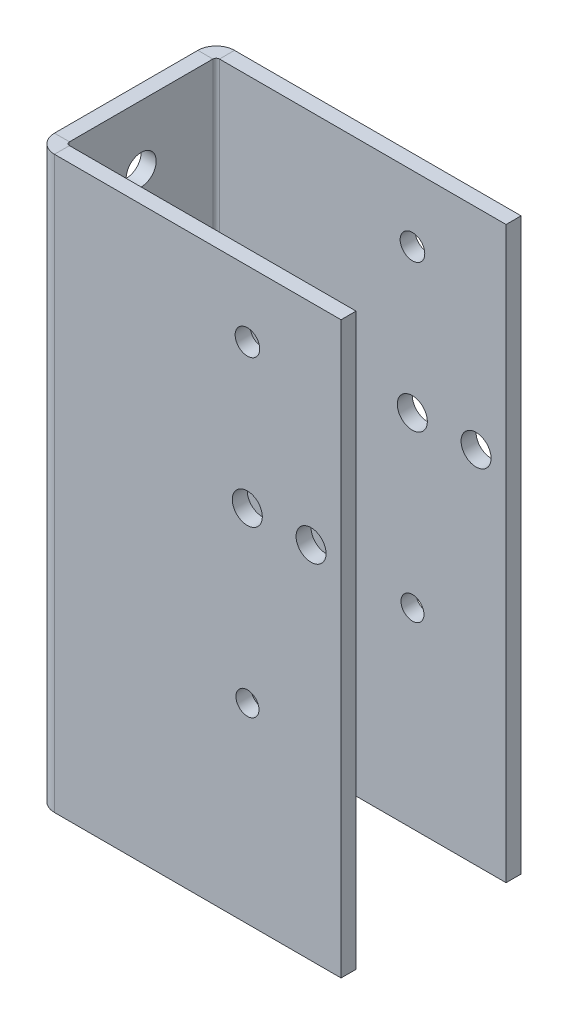
ISO-10303-21;
HEADER;
FILE_DESCRIPTION(('STEP AP214'),'2;1');
FILE_NAME('part.step','',(''),(''),'','','');
FILE_SCHEMA(('AUTOMOTIVE_DESIGN { 1 0 10303 214 1 1 1 1 }'));
ENDSEC;
DATA;
#1=APPLICATION_CONTEXT('core data for automotive mechanical design processes');
#2=APPLICATION_PROTOCOL_DEFINITION('international standard','automotive_design',2000,#1);
#3=PRODUCT_CONTEXT('',#1,'mechanical');
#4=PRODUCT('Part','Part','',(#3));
#5=PRODUCT_RELATED_PRODUCT_CATEGORY('part','',(#4));
#6=PRODUCT_DEFINITION_FORMATION('','',#4);
#7=PRODUCT_DEFINITION_CONTEXT('part definition',#1,'design');
#8=PRODUCT_DEFINITION('design','',#6,#7);
#9=PRODUCT_DEFINITION_SHAPE('','',#8);
#10=(LENGTH_UNIT() NAMED_UNIT(*) SI_UNIT(.MILLI.,.METRE.));
#11=(NAMED_UNIT(*) PLANE_ANGLE_UNIT() SI_UNIT($,.RADIAN.));
#12=(NAMED_UNIT(*) SI_UNIT($,.STERADIAN.) SOLID_ANGLE_UNIT());
#13=UNCERTAINTY_MEASURE_WITH_UNIT(LENGTH_MEASURE(1.E-05),#10,'distance_accuracy_value','');
#14=(GEOMETRIC_REPRESENTATION_CONTEXT(3) GLOBAL_UNCERTAINTY_ASSIGNED_CONTEXT((#13)) GLOBAL_UNIT_ASSIGNED_CONTEXT((#10,
#11,#12)) REPRESENTATION_CONTEXT('',''));
#15=CARTESIAN_POINT('',(0.,0.,0.));
#16=DIRECTION('',(0.,0.,1.));
#17=DIRECTION('',(1.,0.,0.));
#18=AXIS2_PLACEMENT_3D('',#15,#16,#17);
#19=CARTESIAN_POINT('',(-18.885,76.,10.));
#20=DIRECTION('',(0.,1.,0.));
#21=DIRECTION('',(0.,0.,1.));
#22=AXIS2_PLACEMENT_3D('',#19,#20,#21);
#23=PLANE('',#22);
#24=DIRECTION('',(0.,0.,1.));
#25=VECTOR('',#24,1.);
#26=CARTESIAN_POINT('',(-18.885,76.,10.));
#27=LINE('',#26,#25);
#28=CARTESIAN_POINT('',(-18.885,76.,10.));
#29=VERTEX_POINT('',#28);
#30=CARTESIAN_POINT('',(-18.885,76.,12.));
#31=VERTEX_POINT('',#30);
#32=EDGE_CURVE('E11',#29,#31,#27,.T.);
#33=ORIENTED_EDGE('',*,*,#32,.F.);
#34=CARTESIAN_POINT('',(-18.885,76.,9.56));
#35=DIRECTION('',(0.,1.,0.));
#36=DIRECTION('',(0.,0.,1.));
#37=AXIS2_PLACEMENT_3D('',#34,#35,#36);
#38=CIRCLE('',#37,0.44);
#39=CARTESIAN_POINT('',(-19.325,76.,9.56));
#40=VERTEX_POINT('',#39);
#41=EDGE_CURVE('E243',#40,#29,#38,.T.);
#42=ORIENTED_EDGE('',*,*,#41,.F.);
#43=DIRECTION('',(1.,0.,0.));
#44=VECTOR('',#43,1.);
#45=CARTESIAN_POINT('',(-21.325,76.,9.56));
#46=LINE('',#45,#44);
#47=CARTESIAN_POINT('',(-21.325,76.,9.56));
#48=VERTEX_POINT('',#47);
#49=EDGE_CURVE('E45',#48,#40,#46,.T.);
#50=ORIENTED_EDGE('',*,*,#49,.F.);
#51=CARTESIAN_POINT('',(-18.885,76.,9.56));
#52=DIRECTION('',(0.,1.,0.));
#53=DIRECTION('',(1.,0.,0.));
#54=AXIS2_PLACEMENT_3D('',#51,#52,#53);
#55=CIRCLE('',#54,2.44);
#56=EDGE_CURVE('E169',#48,#31,#55,.T.);
#57=ORIENTED_EDGE('',*,*,#56,.T.);
#58=EDGE_LOOP('',(#33,#42,#50,#57));
#59=FACE_BOUND('',#58,.T.);
#60=ADVANCED_FACE('F37',(#59),#23,.T.);
#61=CARTESIAN_POINT('',(-21.325,76.,9.56));
#62=DIRECTION('',(0.,1.,0.));
#63=DIRECTION('',(0.,0.,1.));
#64=AXIS2_PLACEMENT_3D('',#61,#62,#63);
#65=PLANE('',#64);
#66=DIRECTION('',(1.,0.,0.));
#67=VECTOR('',#66,1.);
#68=CARTESIAN_POINT('',(19.325,76.,10.));
#69=LINE('',#68,#67);
#70=CARTESIAN_POINT('',(19.325,76.,10.));
#71=VERTEX_POINT('',#70);
#72=EDGE_CURVE('E247',#29,#71,#69,.T.);
#73=ORIENTED_EDGE('',*,*,#72,.F.);
#74=ORIENTED_EDGE('',*,*,#32,.T.);
#75=DIRECTION('',(1.,0.,0.));
#76=VECTOR('',#75,1.);
#77=CARTESIAN_POINT('',(19.325,76.,12.));
#78=LINE('',#77,#76);
#79=CARTESIAN_POINT('',(19.325,76.,12.));
#80=VERTEX_POINT('',#79);
#81=EDGE_CURVE('E105',#31,#80,#78,.T.);
#82=ORIENTED_EDGE('',*,*,#81,.T.);
#83=DIRECTION('',(0.,0.,1.));
#84=VECTOR('',#83,1.);
#85=CARTESIAN_POINT('',(19.325,76.,10.));
#86=LINE('',#85,#84);
#87=EDGE_CURVE('E698',#71,#80,#86,.T.);
#88=ORIENTED_EDGE('',*,*,#87,.F.);
#89=EDGE_LOOP('',(#73,#74,#82,#88));
#90=FACE_BOUND('',#89,.T.);
#91=ADVANCED_FACE('F296',(#90),#65,.T.);
#92=CARTESIAN_POINT('',(-19.325,0.,9.56));
#93=DIRECTION('',(0.,-1.,0.));
#94=DIRECTION('',(0.,0.,-1.));
#95=AXIS2_PLACEMENT_3D('',#92,#93,#94);
#96=PLANE('',#95);
#97=DIRECTION('',(-1.,0.,0.));
#98=VECTOR('',#97,1.);
#99=CARTESIAN_POINT('',(-19.325,0.,9.56));
#100=LINE('',#99,#98);
#101=CARTESIAN_POINT('',(-19.325,0.,9.56));
#102=VERTEX_POINT('',#101);
#103=CARTESIAN_POINT('',(-21.325,0.,9.56));
#104=VERTEX_POINT('',#103);
#105=EDGE_CURVE('E92',#102,#104,#100,.T.);
#106=ORIENTED_EDGE('',*,*,#105,.F.);
#107=CARTESIAN_POINT('',(-18.885,0.,9.56));
#108=DIRECTION('',(0.,1.,0.));
#109=DIRECTION('',(0.,0.,1.));
#110=AXIS2_PLACEMENT_3D('',#107,#108,#109);
#111=CIRCLE('',#110,0.44);
#112=CARTESIAN_POINT('',(-18.885,0.,10.));
#113=VERTEX_POINT('',#112);
#114=EDGE_CURVE('E185',#102,#113,#111,.T.);
#115=ORIENTED_EDGE('',*,*,#114,.T.);
#116=DIRECTION('',(0.,0.,-1.));
#117=VECTOR('',#116,1.);
#118=CARTESIAN_POINT('',(-18.885,0.,12.));
#119=LINE('',#118,#117);
#120=CARTESIAN_POINT('',(-18.885,0.,12.));
#121=VERTEX_POINT('',#120);
#122=EDGE_CURVE('E99',#121,#113,#119,.T.);
#123=ORIENTED_EDGE('',*,*,#122,.F.);
#124=CARTESIAN_POINT('',(-18.885,0.,9.56));
#125=DIRECTION('',(0.,1.,0.));
#126=DIRECTION('',(1.,0.,0.));
#127=AXIS2_PLACEMENT_3D('',#124,#125,#126);
#128=CIRCLE('',#127,2.44);
#129=EDGE_CURVE('E204',#104,#121,#128,.T.);
#130=ORIENTED_EDGE('',*,*,#129,.F.);
#131=EDGE_LOOP('',(#106,#115,#123,#130));
#132=FACE_BOUND('',#131,.T.);
#133=ADVANCED_FACE('F300',(#132),#96,.T.);
#134=CARTESIAN_POINT('',(-18.885,0.,12.));
#135=DIRECTION('',(0.,-1.,0.));
#136=DIRECTION('',(0.,0.,-1.));
#137=AXIS2_PLACEMENT_3D('',#134,#135,#136);
#138=PLANE('',#137);
#139=DIRECTION('',(0.,0.,1.));
#140=VECTOR('',#139,1.);
#141=CARTESIAN_POINT('',(-19.325,0.,10.));
#142=LINE('',#141,#140);
#143=CARTESIAN_POINT('',(-19.325,0.,-9.56));
#144=VERTEX_POINT('',#143);
#145=EDGE_CURVE('E187',#144,#102,#142,.T.);
#146=ORIENTED_EDGE('',*,*,#145,.T.);
#147=ORIENTED_EDGE('',*,*,#105,.T.);
#148=DIRECTION('',(0.,0.,-1.));
#149=VECTOR('',#148,1.);
#150=CARTESIAN_POINT('',(-21.325,0.,10.));
#151=LINE('',#150,#149);
#152=CARTESIAN_POINT('',(-21.325,0.,-9.56));
#153=VERTEX_POINT('',#152);
#154=EDGE_CURVE('E202',#153,#104,#151,.F.);
#155=ORIENTED_EDGE('',*,*,#154,.F.);
#156=DIRECTION('',(1.,0.,0.));
#157=VECTOR('',#156,1.);
#158=CARTESIAN_POINT('',(-21.325,0.,-9.56));
#159=LINE('',#158,#157);
#160=EDGE_CURVE('E230',#153,#144,#159,.T.);
#161=ORIENTED_EDGE('',*,*,#160,.T.);
#162=EDGE_LOOP('',(#146,#147,#155,#161));
#163=FACE_BOUND('',#162,.T.);
#164=ADVANCED_FACE('F273',(#163),#138,.T.);
#165=CARTESIAN_POINT('',(-19.325,76.,-9.56));
#166=DIRECTION('',(0.,1.,0.));
#167=DIRECTION('',(0.,0.,1.));
#168=AXIS2_PLACEMENT_3D('',#165,#166,#167);
#169=PLANE('',#168);
#170=DIRECTION('',(-1.,0.,0.));
#171=VECTOR('',#170,1.);
#172=CARTESIAN_POINT('',(-19.325,76.,-9.56));
#173=LINE('',#172,#171);
#174=CARTESIAN_POINT('',(-19.325,76.,-9.56));
#175=VERTEX_POINT('',#174);
#176=CARTESIAN_POINT('',(-21.325,76.,-9.56));
#177=VERTEX_POINT('',#176);
#178=EDGE_CURVE('E133',#175,#177,#173,.T.);
#179=ORIENTED_EDGE('',*,*,#178,.F.);
#180=CARTESIAN_POINT('',(-18.885,76.,-9.56));
#181=DIRECTION('',(0.,1.,0.));
#182=DIRECTION('',(0.,0.,1.));
#183=AXIS2_PLACEMENT_3D('',#180,#181,#182);
#184=CIRCLE('',#183,0.44);
#185=CARTESIAN_POINT('',(-18.885,76.,-10.));
#186=VERTEX_POINT('',#185);
#187=EDGE_CURVE('E250',#186,#175,#184,.T.);
#188=ORIENTED_EDGE('',*,*,#187,.F.);
#189=DIRECTION('',(0.,0.,1.));
#190=VECTOR('',#189,1.);
#191=CARTESIAN_POINT('',(-18.885,76.,-12.));
#192=LINE('',#191,#190);
#193=CARTESIAN_POINT('',(-18.885,76.,-12.));
#194=VERTEX_POINT('',#193);
#195=EDGE_CURVE('E145',#194,#186,#192,.T.);
#196=ORIENTED_EDGE('',*,*,#195,.F.);
#197=CARTESIAN_POINT('',(-18.885,76.,-9.56));
#198=DIRECTION('',(0.,1.,0.));
#199=DIRECTION('',(1.,0.,0.));
#200=AXIS2_PLACEMENT_3D('',#197,#198,#199);
#201=CIRCLE('',#200,2.44);
#202=EDGE_CURVE('E148',#194,#177,#201,.T.);
#203=ORIENTED_EDGE('',*,*,#202,.T.);
#204=EDGE_LOOP('',(#179,#188,#196,#203));
#205=FACE_BOUND('',#204,.T.);
#206=ADVANCED_FACE('F150',(#205),#169,.T.);
#207=CARTESIAN_POINT('',(-18.885,76.,-12.));
#208=DIRECTION('',(0.,1.,0.));
#209=DIRECTION('',(0.,0.,1.));
#210=AXIS2_PLACEMENT_3D('',#207,#208,#209);
#211=PLANE('',#210);
#212=DIRECTION('',(0.,0.,1.));
#213=VECTOR('',#212,1.);
#214=CARTESIAN_POINT('',(-19.325,76.,10.));
#215=LINE('',#214,#213);
#216=EDGE_CURVE('E140',#175,#40,#215,.T.);
#217=ORIENTED_EDGE('',*,*,#216,.F.);
#218=ORIENTED_EDGE('',*,*,#178,.T.);
#219=DIRECTION('',(0.,0.,-1.));
#220=VECTOR('',#219,1.);
#221=CARTESIAN_POINT('',(-21.325,76.,10.));
#222=LINE('',#221,#220);
#223=EDGE_CURVE('E137',#177,#48,#222,.F.);
#224=ORIENTED_EDGE('',*,*,#223,.T.);
#225=ORIENTED_EDGE('',*,*,#49,.T.);
#226=EDGE_LOOP('',(#217,#218,#224,#225));
#227=FACE_BOUND('',#226,.T.);
#228=ADVANCED_FACE('F135',(#227),#211,.T.);
#229=CARTESIAN_POINT('',(-18.885,0.,-10.));
#230=DIRECTION('',(0.,-1.,0.));
#231=DIRECTION('',(0.,0.,-1.));
#232=AXIS2_PLACEMENT_3D('',#229,#230,#231);
#233=PLANE('',#232);
#234=DIRECTION('',(0.,0.,-1.));
#235=VECTOR('',#234,1.);
#236=CARTESIAN_POINT('',(-18.885,0.,-10.));
#237=LINE('',#236,#235);
#238=CARTESIAN_POINT('',(-18.885,0.,-10.));
#239=VERTEX_POINT('',#238);
#240=CARTESIAN_POINT('',(-18.885,0.,-12.));
#241=VERTEX_POINT('',#240);
#242=EDGE_CURVE('E232',#239,#241,#237,.T.);
#243=ORIENTED_EDGE('',*,*,#242,.F.);
#244=CARTESIAN_POINT('',(-18.885,0.,-9.56));
#245=DIRECTION('',(0.,1.,0.));
#246=DIRECTION('',(0.,0.,1.));
#247=AXIS2_PLACEMENT_3D('',#244,#245,#246);
#248=CIRCLE('',#247,0.44);
#249=EDGE_CURVE('E189',#239,#144,#248,.T.);
#250=ORIENTED_EDGE('',*,*,#249,.T.);
#251=ORIENTED_EDGE('',*,*,#160,.F.);
#252=CARTESIAN_POINT('',(-18.885,0.,-9.56));
#253=DIRECTION('',(0.,1.,0.));
#254=DIRECTION('',(1.,0.,0.));
#255=AXIS2_PLACEMENT_3D('',#252,#253,#254);
#256=CIRCLE('',#255,2.44);
#257=EDGE_CURVE('E161',#241,#153,#256,.T.);
#258=ORIENTED_EDGE('',*,*,#257,.F.);
#259=EDGE_LOOP('',(#243,#250,#251,#258));
#260=FACE_BOUND('',#259,.T.);
#261=ADVANCED_FACE('F271',(#260),#233,.T.);
#262=CARTESIAN_POINT('',(-21.325,0.,-9.56));
#263=DIRECTION('',(0.,-1.,0.));
#264=DIRECTION('',(0.,0.,-1.));
#265=AXIS2_PLACEMENT_3D('',#262,#263,#264);
#266=PLANE('',#265);
#267=DIRECTION('',(-1.,0.,0.));
#268=VECTOR('',#267,1.);
#269=CARTESIAN_POINT('',(19.325,0.,-10.));
#270=LINE('',#269,#268);
#271=CARTESIAN_POINT('',(19.325,0.,-10.));
#272=VERTEX_POINT('',#271);
#273=EDGE_CURVE('E192',#272,#239,#270,.T.);
#274=ORIENTED_EDGE('',*,*,#273,.T.);
#275=ORIENTED_EDGE('',*,*,#242,.T.);
#276=DIRECTION('',(-1.,0.,0.));
#277=VECTOR('',#276,1.);
#278=CARTESIAN_POINT('',(19.325,0.,-12.));
#279=LINE('',#278,#277);
#280=CARTESIAN_POINT('',(19.325,0.,-12.));
#281=VERTEX_POINT('',#280);
#282=EDGE_CURVE('E198',#281,#241,#279,.T.);
#283=ORIENTED_EDGE('',*,*,#282,.F.);
#284=DIRECTION('',(0.,0.,1.));
#285=VECTOR('',#284,1.);
#286=CARTESIAN_POINT('',(19.325,0.,-12.));
#287=LINE('',#286,#285);
#288=EDGE_CURVE('E195',#281,#272,#287,.T.);
#289=ORIENTED_EDGE('',*,*,#288,.T.);
#290=EDGE_LOOP('',(#274,#275,#283,#289));
#291=FACE_BOUND('',#290,.T.);
#292=ADVANCED_FACE('F283',(#291),#266,.T.);
#293=CARTESIAN_POINT('',(19.325,76.,12.));
#294=DIRECTION('',(0.,0.,-1.));
#295=DIRECTION('',(-1.,0.,0.));
#296=AXIS2_PLACEMENT_3D('',#293,#294,#295);
#297=PLANE('',#296);
#298=CARTESIAN_POINT('',(15.325,48.,12.));
#299=DIRECTION('',(0.,0.,-1.));
#300=DIRECTION('',(-1.,0.,0.));
#301=AXIS2_PLACEMENT_3D('',#298,#299,#300);
#302=CIRCLE('',#301,2.);
#303=CARTESIAN_POINT('',(13.325,48.,12.));
#304=VERTEX_POINT('',#303);
#305=EDGE_CURVE('E653',#304,#304,#302,.F.);
#306=ORIENTED_EDGE('',*,*,#305,.F.);
#307=EDGE_LOOP('',(#306));
#308=FACE_BOUND('',#307,.T.);
#309=CARTESIAN_POINT('',(6.825,48.,12.));
#310=DIRECTION('',(0.,0.,-1.));
#311=DIRECTION('',(-1.,0.,0.));
#312=AXIS2_PLACEMENT_3D('',#309,#310,#311);
#313=CIRCLE('',#312,2.00000000000001);
#314=CARTESIAN_POINT('',(4.82499999999999,48.,12.));
#315=VERTEX_POINT('',#314);
#316=EDGE_CURVE('E665',#315,#315,#313,.F.);
#317=ORIENTED_EDGE('',*,*,#316,.F.);
#318=EDGE_LOOP('',(#317));
#319=FACE_BOUND('',#318,.T.);
#320=CARTESIAN_POINT('',(6.845,25.5,12.));
#321=DIRECTION('',(0.,0.,-1.));
#322=DIRECTION('',(-1.,0.,0.));
#323=AXIS2_PLACEMENT_3D('',#320,#321,#322);
#324=CIRCLE('',#323,1.53399793358523);
#325=CARTESIAN_POINT('',(5.31100206641477,25.5,12.));
#326=VERTEX_POINT('',#325);
#327=EDGE_CURVE('E677',#326,#326,#324,.F.);
#328=ORIENTED_EDGE('',*,*,#327,.F.);
#329=EDGE_LOOP('',(#328));
#330=FACE_BOUND('',#329,.T.);
#331=CARTESIAN_POINT('',(6.845,67.2,12.));
#332=DIRECTION('',(0.,0.,-1.));
#333=DIRECTION('',(-1.,0.,0.));
#334=AXIS2_PLACEMENT_3D('',#331,#332,#333);
#335=CIRCLE('',#334,1.64068926109748);
#336=CARTESIAN_POINT('',(5.20431073890252,67.2,12.));
#337=VERTEX_POINT('',#336);
#338=EDGE_CURVE('E689',#337,#337,#335,.F.);
#339=ORIENTED_EDGE('',*,*,#338,.F.);
#340=EDGE_LOOP('',(#339));
#341=FACE_BOUND('',#340,.T.);
#342=DIRECTION('',(1.,0.,0.));
#343=VECTOR('',#342,1.);
#344=CARTESIAN_POINT('',(19.325,0.,12.));
#345=LINE('',#344,#343);
#346=CARTESIAN_POINT('',(19.325,0.,12.));
#347=VERTEX_POINT('',#346);
#348=EDGE_CURVE('E175',#121,#347,#345,.T.);
#349=ORIENTED_EDGE('',*,*,#348,.T.);
#350=DIRECTION('',(0.,-1.,0.));
#351=VECTOR('',#350,1.);
#352=CARTESIAN_POINT('',(19.325,76.,12.));
#353=LINE('',#352,#351);
#354=EDGE_CURVE('E228',#80,#347,#353,.T.);
#355=ORIENTED_EDGE('',*,*,#354,.F.);
#356=ORIENTED_EDGE('',*,*,#81,.F.);
#357=DIRECTION('',(0.,-1.,0.));
#358=VECTOR('',#357,1.);
#359=CARTESIAN_POINT('',(-18.885,76.,12.));
#360=LINE('',#359,#358);
#361=EDGE_CURVE('E171',#31,#121,#360,.T.);
#362=ORIENTED_EDGE('',*,*,#361,.T.);
#363=EDGE_LOOP('',(#349,#355,#356,#362));
#364=FACE_BOUND('',#363,.T.);
#365=ADVANCED_FACE('F285',(#308,#319,#330,#341,#364),#297,.F.);
#366=CARTESIAN_POINT('',(19.325,76.,10.));
#367=DIRECTION('',(1.,0.,0.));
#368=DIRECTION('',(0.,0.,-1.));
#369=AXIS2_PLACEMENT_3D('',#366,#367,#368);
#370=PLANE('',#369);
#371=DIRECTION('',(0.,0.,1.));
#372=VECTOR('',#371,1.);
#373=CARTESIAN_POINT('',(19.325,0.,10.));
#374=LINE('',#373,#372);
#375=CARTESIAN_POINT('',(19.325,0.,10.));
#376=VERTEX_POINT('',#375);
#377=EDGE_CURVE('E178',#376,#347,#374,.T.);
#378=ORIENTED_EDGE('',*,*,#377,.F.);
#379=DIRECTION('',(0.,-1.,0.));
#380=VECTOR('',#379,1.);
#381=CARTESIAN_POINT('',(19.325,76.,10.));
#382=LINE('',#381,#380);
#383=EDGE_CURVE('E226',#71,#376,#382,.T.);
#384=ORIENTED_EDGE('',*,*,#383,.F.);
#385=ORIENTED_EDGE('',*,*,#87,.T.);
#386=ORIENTED_EDGE('',*,*,#354,.T.);
#387=EDGE_LOOP('',(#378,#384,#385,#386));
#388=FACE_BOUND('',#387,.T.);
#389=ADVANCED_FACE('F291',(#388),#370,.T.);
#390=CARTESIAN_POINT('',(19.325,76.,10.));
#391=DIRECTION('',(0.,0.,-1.));
#392=DIRECTION('',(-1.,0.,0.));
#393=AXIS2_PLACEMENT_3D('',#390,#391,#392);
#394=PLANE('',#393);
#395=CARTESIAN_POINT('',(15.325,48.,10.));
#396=DIRECTION('',(0.,0.,-1.));
#397=DIRECTION('',(-1.,0.,0.));
#398=AXIS2_PLACEMENT_3D('',#395,#396,#397);
#399=CIRCLE('',#398,2.);
#400=CARTESIAN_POINT('',(13.325,48.,10.));
#401=VERTEX_POINT('',#400);
#402=EDGE_CURVE('E659',#401,#401,#399,.T.);
#403=ORIENTED_EDGE('',*,*,#402,.F.);
#404=EDGE_LOOP('',(#403));
#405=FACE_BOUND('',#404,.T.);
#406=CARTESIAN_POINT('',(6.825,48.,10.));
#407=DIRECTION('',(0.,0.,-1.));
#408=DIRECTION('',(-1.,0.,0.));
#409=AXIS2_PLACEMENT_3D('',#406,#407,#408);
#410=CIRCLE('',#409,2.00000000000001);
#411=CARTESIAN_POINT('',(4.82499999999999,48.,10.));
#412=VERTEX_POINT('',#411);
#413=EDGE_CURVE('E671',#412,#412,#410,.T.);
#414=ORIENTED_EDGE('',*,*,#413,.F.);
#415=EDGE_LOOP('',(#414));
#416=FACE_BOUND('',#415,.T.);
#417=CARTESIAN_POINT('',(6.845,25.5,10.));
#418=DIRECTION('',(0.,0.,-1.));
#419=DIRECTION('',(-1.,0.,0.));
#420=AXIS2_PLACEMENT_3D('',#417,#418,#419);
#421=CIRCLE('',#420,1.53399793358523);
#422=CARTESIAN_POINT('',(5.31100206641477,25.5,10.));
#423=VERTEX_POINT('',#422);
#424=EDGE_CURVE('E683',#423,#423,#421,.T.);
#425=ORIENTED_EDGE('',*,*,#424,.F.);
#426=EDGE_LOOP('',(#425));
#427=FACE_BOUND('',#426,.T.);
#428=CARTESIAN_POINT('',(6.845,67.2,10.));
#429=DIRECTION('',(0.,0.,-1.));
#430=DIRECTION('',(-1.,0.,0.));
#431=AXIS2_PLACEMENT_3D('',#428,#429,#430);
#432=CIRCLE('',#431,1.64068926109748);
#433=CARTESIAN_POINT('',(5.20431073890252,67.2,10.));
#434=VERTEX_POINT('',#433);
#435=EDGE_CURVE('E179',#434,#434,#432,.T.);
#436=ORIENTED_EDGE('',*,*,#435,.F.);
#437=EDGE_LOOP('',(#436));
#438=FACE_BOUND('',#437,.T.);
#439=DIRECTION('',(1.,0.,0.));
#440=VECTOR('',#439,1.);
#441=CARTESIAN_POINT('',(19.325,0.,10.));
#442=LINE('',#441,#440);
#443=EDGE_CURVE('E182',#113,#376,#442,.T.);
#444=ORIENTED_EDGE('',*,*,#443,.F.);
#445=DIRECTION('',(0.,-1.,0.));
#446=VECTOR('',#445,1.);
#447=CARTESIAN_POINT('',(-18.885,76.,10.));
#448=LINE('',#447,#446);
#449=EDGE_CURVE('E223',#29,#113,#448,.T.);
#450=ORIENTED_EDGE('',*,*,#449,.F.);
#451=ORIENTED_EDGE('',*,*,#72,.T.);
#452=ORIENTED_EDGE('',*,*,#383,.T.);
#453=EDGE_LOOP('',(#444,#450,#451,#452));
#454=FACE_BOUND('',#453,.T.);
#455=ADVANCED_FACE('F335',(#405,#416,#427,#438,#454),#394,.T.);
#456=CARTESIAN_POINT('',(-18.885,76.,9.56));
#457=DIRECTION('',(0.,-1.,0.));
#458=DIRECTION('',(0.,0.,-1.));
#459=AXIS2_PLACEMENT_3D('',#456,#457,#458);
#460=CYLINDRICAL_SURFACE('',#459,0.44);
#461=ORIENTED_EDGE('',*,*,#114,.F.);
#462=DIRECTION('',(0.,-1.,0.));
#463=VECTOR('',#462,1.);
#464=CARTESIAN_POINT('',(-19.325,76.,9.56));
#465=LINE('',#464,#463);
#466=EDGE_CURVE('E220',#40,#102,#465,.T.);
#467=ORIENTED_EDGE('',*,*,#466,.F.);
#468=ORIENTED_EDGE('',*,*,#41,.T.);
#469=ORIENTED_EDGE('',*,*,#449,.T.);
#470=EDGE_LOOP('',(#461,#467,#468,#469));
#471=FACE_BOUND('',#470,.T.);
#472=ADVANCED_FACE('F242',(#471),#460,.F.);
#473=CARTESIAN_POINT('',(-19.325,76.,10.));
#474=DIRECTION('',(1.,0.,0.));
#475=DIRECTION('',(0.,0.,-1.));
#476=AXIS2_PLACEMENT_3D('',#473,#474,#475);
#477=PLANE('',#476);
#478=CARTESIAN_POINT('',(-19.325,8.,0.));
#479=DIRECTION('',(1.,0.,0.));
#480=DIRECTION('',(0.,0.,-1.));
#481=AXIS2_PLACEMENT_3D('',#478,#479,#480);
#482=CIRCLE('',#481,2.);
#483=CARTESIAN_POINT('',(-19.325,8.,-2.));
#484=VERTEX_POINT('',#483);
#485=EDGE_CURVE('E637',#484,#484,#482,.T.);
#486=ORIENTED_EDGE('',*,*,#485,.F.);
#487=EDGE_LOOP('',(#486));
#488=FACE_BOUND('',#487,.T.);
#489=CARTESIAN_POINT('',(-19.325,68.,0.));
#490=DIRECTION('',(1.,0.,0.));
#491=DIRECTION('',(0.,0.,-1.));
#492=AXIS2_PLACEMENT_3D('',#489,#490,#491);
#493=CIRCLE('',#492,2.);
#494=CARTESIAN_POINT('',(-19.325,68.,-2.));
#495=VERTEX_POINT('',#494);
#496=EDGE_CURVE('E641',#495,#495,#493,.T.);
#497=ORIENTED_EDGE('',*,*,#496,.F.);
#498=EDGE_LOOP('',(#497));
#499=FACE_BOUND('',#498,.T.);
#500=ORIENTED_EDGE('',*,*,#145,.F.);
#501=DIRECTION('',(0.,-1.,0.));
#502=VECTOR('',#501,1.);
#503=CARTESIAN_POINT('',(-19.325,76.,-9.56));
#504=LINE('',#503,#502);
#505=EDGE_CURVE('E217',#175,#144,#504,.T.);
#506=ORIENTED_EDGE('',*,*,#505,.F.);
#507=ORIENTED_EDGE('',*,*,#216,.T.);
#508=ORIENTED_EDGE('',*,*,#466,.T.);
#509=EDGE_LOOP('',(#500,#506,#507,#508));
#510=FACE_BOUND('',#509,.T.);
#511=ADVANCED_FACE('F249',(#488,#499,#510),#477,.T.);
#512=CARTESIAN_POINT('',(-18.885,76.,-9.56));
#513=DIRECTION('',(0.,-1.,0.));
#514=DIRECTION('',(0.,0.,-1.));
#515=AXIS2_PLACEMENT_3D('',#512,#513,#514);
#516=CYLINDRICAL_SURFACE('',#515,0.44);
#517=ORIENTED_EDGE('',*,*,#249,.F.);
#518=DIRECTION('',(0.,-1.,0.));
#519=VECTOR('',#518,1.);
#520=CARTESIAN_POINT('',(-18.885,76.,-10.));
#521=LINE('',#520,#519);
#522=EDGE_CURVE('E214',#186,#239,#521,.T.);
#523=ORIENTED_EDGE('',*,*,#522,.F.);
#524=ORIENTED_EDGE('',*,*,#187,.T.);
#525=ORIENTED_EDGE('',*,*,#505,.T.);
#526=EDGE_LOOP('',(#517,#523,#524,#525));
#527=FACE_BOUND('',#526,.T.);
#528=ADVANCED_FACE('F275',(#527),#516,.F.);
#529=CARTESIAN_POINT('',(19.325,76.,-10.));
#530=DIRECTION('',(0.,0.,1.));
#531=DIRECTION('',(1.,0.,0.));
#532=AXIS2_PLACEMENT_3D('',#529,#530,#531);
#533=PLANE('',#532);
#534=CARTESIAN_POINT('',(15.325,48.,-10.));
#535=DIRECTION('',(0.,0.,1.));
#536=DIRECTION('',(1.,0.,0.));
#537=AXIS2_PLACEMENT_3D('',#534,#535,#536);
#538=CIRCLE('',#537,2.);
#539=CARTESIAN_POINT('',(17.325,48.,-10.));
#540=VERTEX_POINT('',#539);
#541=EDGE_CURVE('E656',#540,#540,#538,.T.);
#542=ORIENTED_EDGE('',*,*,#541,.F.);
#543=EDGE_LOOP('',(#542));
#544=FACE_BOUND('',#543,.T.);
#545=CARTESIAN_POINT('',(6.825,48.,-10.));
#546=DIRECTION('',(0.,0.,1.));
#547=DIRECTION('',(1.,0.,0.));
#548=AXIS2_PLACEMENT_3D('',#545,#546,#547);
#549=CIRCLE('',#548,2.00000000000001);
#550=CARTESIAN_POINT('',(8.825,48.,-10.));
#551=VERTEX_POINT('',#550);
#552=EDGE_CURVE('E668',#551,#551,#549,.T.);
#553=ORIENTED_EDGE('',*,*,#552,.F.);
#554=EDGE_LOOP('',(#553));
#555=FACE_BOUND('',#554,.T.);
#556=CARTESIAN_POINT('',(6.845,25.5,-10.));
#557=DIRECTION('',(0.,0.,1.));
#558=DIRECTION('',(1.,0.,0.));
#559=AXIS2_PLACEMENT_3D('',#556,#557,#558);
#560=CIRCLE('',#559,1.53399793358523);
#561=CARTESIAN_POINT('',(8.37899793358523,25.5,-10.));
#562=VERTEX_POINT('',#561);
#563=EDGE_CURVE('E680',#562,#562,#560,.T.);
#564=ORIENTED_EDGE('',*,*,#563,.F.);
#565=EDGE_LOOP('',(#564));
#566=FACE_BOUND('',#565,.T.);
#567=CARTESIAN_POINT('',(6.845,67.2,-10.));
#568=DIRECTION('',(0.,0.,1.));
#569=DIRECTION('',(1.,0.,0.));
#570=AXIS2_PLACEMENT_3D('',#567,#568,#569);
#571=CIRCLE('',#570,1.64068926109748);
#572=CARTESIAN_POINT('',(8.48568926109748,67.2,-10.));
#573=VERTEX_POINT('',#572);
#574=EDGE_CURVE('E692',#573,#573,#571,.T.);
#575=ORIENTED_EDGE('',*,*,#574,.F.);
#576=EDGE_LOOP('',(#575));
#577=FACE_BOUND('',#576,.T.);
#578=ORIENTED_EDGE('',*,*,#273,.F.);
#579=DIRECTION('',(0.,-1.,0.));
#580=VECTOR('',#579,1.);
#581=CARTESIAN_POINT('',(19.325,76.,-10.));
#582=LINE('',#581,#580);
#583=CARTESIAN_POINT('',(19.325,76.,-10.));
#584=VERTEX_POINT('',#583);
#585=EDGE_CURVE('E212',#584,#272,#582,.T.);
#586=ORIENTED_EDGE('',*,*,#585,.F.);
#587=DIRECTION('',(-1.,0.,0.));
#588=VECTOR('',#587,1.);
#589=CARTESIAN_POINT('',(19.325,76.,-10.));
#590=LINE('',#589,#588);
#591=EDGE_CURVE('E252',#584,#186,#590,.T.);
#592=ORIENTED_EDGE('',*,*,#591,.T.);
#593=ORIENTED_EDGE('',*,*,#522,.T.);
#594=EDGE_LOOP('',(#578,#586,#592,#593));
#595=FACE_BOUND('',#594,.T.);
#596=ADVANCED_FACE('F278',(#544,#555,#566,#577,#595),#533,.T.);
#597=CARTESIAN_POINT('',(19.325,76.,-12.));
#598=DIRECTION('',(1.,0.,0.));
#599=DIRECTION('',(0.,0.,-1.));
#600=AXIS2_PLACEMENT_3D('',#597,#598,#599);
#601=PLANE('',#600);
#602=ORIENTED_EDGE('',*,*,#288,.F.);
#603=DIRECTION('',(0.,-1.,0.));
#604=VECTOR('',#603,1.);
#605=CARTESIAN_POINT('',(19.325,76.,-12.));
#606=LINE('',#605,#604);
#607=CARTESIAN_POINT('',(19.325,76.,-12.));
#608=VERTEX_POINT('',#607);
#609=EDGE_CURVE('E210',#608,#281,#606,.T.);
#610=ORIENTED_EDGE('',*,*,#609,.F.);
#611=DIRECTION('',(0.,0.,1.));
#612=VECTOR('',#611,1.);
#613=CARTESIAN_POINT('',(19.325,76.,-12.));
#614=LINE('',#613,#612);
#615=EDGE_CURVE('E258',#608,#584,#614,.T.);
#616=ORIENTED_EDGE('',*,*,#615,.T.);
#617=ORIENTED_EDGE('',*,*,#585,.T.);
#618=EDGE_LOOP('',(#602,#610,#616,#617));
#619=FACE_BOUND('',#618,.T.);
#620=ADVANCED_FACE('F281',(#619),#601,.T.);
#621=CARTESIAN_POINT('',(19.325,76.,-12.));
#622=DIRECTION('',(0.,0.,1.));
#623=DIRECTION('',(1.,0.,0.));
#624=AXIS2_PLACEMENT_3D('',#621,#622,#623);
#625=PLANE('',#624);
#626=CARTESIAN_POINT('',(15.325,48.,-12.));
#627=DIRECTION('',(0.,0.,-1.));
#628=DIRECTION('',(-1.,0.,0.));
#629=AXIS2_PLACEMENT_3D('',#626,#627,#628);
#630=CIRCLE('',#629,2.);
#631=CARTESIAN_POINT('',(13.325,48.,-12.));
#632=VERTEX_POINT('',#631);
#633=EDGE_CURVE('E650',#632,#632,#630,.T.);
#634=ORIENTED_EDGE('',*,*,#633,.F.);
#635=EDGE_LOOP('',(#634));
#636=FACE_BOUND('',#635,.T.);
#637=CARTESIAN_POINT('',(6.825,48.,-12.));
#638=DIRECTION('',(0.,0.,-1.));
#639=DIRECTION('',(-1.,0.,0.));
#640=AXIS2_PLACEMENT_3D('',#637,#638,#639);
#641=CIRCLE('',#640,2.00000000000001);
#642=CARTESIAN_POINT('',(4.82499999999999,48.,-12.));
#643=VERTEX_POINT('',#642);
#644=EDGE_CURVE('E662',#643,#643,#641,.T.);
#645=ORIENTED_EDGE('',*,*,#644,.F.);
#646=EDGE_LOOP('',(#645));
#647=FACE_BOUND('',#646,.T.);
#648=CARTESIAN_POINT('',(6.845,25.5,-12.));
#649=DIRECTION('',(0.,0.,-1.));
#650=DIRECTION('',(-1.,0.,0.));
#651=AXIS2_PLACEMENT_3D('',#648,#649,#650);
#652=CIRCLE('',#651,1.53399793358523);
#653=CARTESIAN_POINT('',(5.31100206641477,25.5,-12.));
#654=VERTEX_POINT('',#653);
#655=EDGE_CURVE('E674',#654,#654,#652,.T.);
#656=ORIENTED_EDGE('',*,*,#655,.F.);
#657=EDGE_LOOP('',(#656));
#658=FACE_BOUND('',#657,.T.);
#659=CARTESIAN_POINT('',(6.845,67.2,-12.));
#660=DIRECTION('',(0.,0.,-1.));
#661=DIRECTION('',(-1.,0.,0.));
#662=AXIS2_PLACEMENT_3D('',#659,#660,#661);
#663=CIRCLE('',#662,1.64068926109748);
#664=CARTESIAN_POINT('',(5.20431073890251,67.2,-12.));
#665=VERTEX_POINT('',#664);
#666=EDGE_CURVE('E686',#665,#665,#663,.T.);
#667=ORIENTED_EDGE('',*,*,#666,.F.);
#668=EDGE_LOOP('',(#667));
#669=FACE_BOUND('',#668,.T.);
#670=ORIENTED_EDGE('',*,*,#282,.T.);
#671=DIRECTION('',(0.,-1.,0.));
#672=VECTOR('',#671,1.);
#673=CARTESIAN_POINT('',(-18.885,76.,-12.));
#674=LINE('',#673,#672);
#675=EDGE_CURVE('E163',#194,#241,#674,.T.);
#676=ORIENTED_EDGE('',*,*,#675,.F.);
#677=DIRECTION('',(-1.,0.,0.));
#678=VECTOR('',#677,1.);
#679=CARTESIAN_POINT('',(19.325,76.,-12.));
#680=LINE('',#679,#678);
#681=EDGE_CURVE('E154',#608,#194,#680,.T.);
#682=ORIENTED_EDGE('',*,*,#681,.F.);
#683=ORIENTED_EDGE('',*,*,#609,.T.);
#684=EDGE_LOOP('',(#670,#676,#682,#683));
#685=FACE_BOUND('',#684,.T.);
#686=ADVANCED_FACE('F268',(#636,#647,#658,#669,#685),#625,.F.);
#687=CARTESIAN_POINT('',(-18.885,76.,-9.56));
#688=DIRECTION('',(0.,-1.,0.));
#689=DIRECTION('',(0.,0.,-1.));
#690=AXIS2_PLACEMENT_3D('',#687,#688,#689);
#691=CYLINDRICAL_SURFACE('',#690,2.44);
#692=ORIENTED_EDGE('',*,*,#257,.T.);
#693=DIRECTION('',(0.,-1.,0.));
#694=VECTOR('',#693,1.);
#695=CARTESIAN_POINT('',(-21.325,76.,-9.56));
#696=LINE('',#695,#694);
#697=EDGE_CURVE('E158',#177,#153,#696,.T.);
#698=ORIENTED_EDGE('',*,*,#697,.F.);
#699=ORIENTED_EDGE('',*,*,#202,.F.);
#700=ORIENTED_EDGE('',*,*,#675,.T.);
#701=EDGE_LOOP('',(#692,#698,#699,#700));
#702=FACE_BOUND('',#701,.T.);
#703=ADVANCED_FACE('F159',(#702),#691,.T.);
#704=CARTESIAN_POINT('',(-21.325,76.,10.));
#705=DIRECTION('',(1.,0.,0.));
#706=DIRECTION('',(0.,0.,-1.));
#707=AXIS2_PLACEMENT_3D('',#704,#705,#706);
#708=PLANE('',#707);
#709=CARTESIAN_POINT('',(-21.325,8.,0.));
#710=DIRECTION('',(1.,0.,0.));
#711=DIRECTION('',(0.,0.,-1.));
#712=AXIS2_PLACEMENT_3D('',#709,#710,#711);
#713=CIRCLE('',#712,2.);
#714=CARTESIAN_POINT('',(-21.325,8.,-2.));
#715=VERTEX_POINT('',#714);
#716=EDGE_CURVE('E640',#715,#715,#713,.F.);
#717=ORIENTED_EDGE('',*,*,#716,.F.);
#718=EDGE_LOOP('',(#717));
#719=FACE_BOUND('',#718,.T.);
#720=CARTESIAN_POINT('',(-21.325,68.,0.));
#721=DIRECTION('',(1.,0.,0.));
#722=DIRECTION('',(0.,0.,-1.));
#723=AXIS2_PLACEMENT_3D('',#720,#721,#722);
#724=CIRCLE('',#723,2.);
#725=CARTESIAN_POINT('',(-21.325,68.,-2.));
#726=VERTEX_POINT('',#725);
#727=EDGE_CURVE('E644',#726,#726,#724,.F.);
#728=ORIENTED_EDGE('',*,*,#727,.F.);
#729=EDGE_LOOP('',(#728));
#730=FACE_BOUND('',#729,.T.);
#731=ORIENTED_EDGE('',*,*,#154,.T.);
#732=DIRECTION('',(0.,-1.,0.));
#733=VECTOR('',#732,1.);
#734=CARTESIAN_POINT('',(-21.325,76.,9.56));
#735=LINE('',#734,#733);
#736=EDGE_CURVE('E164',#48,#104,#735,.T.);
#737=ORIENTED_EDGE('',*,*,#736,.F.);
#738=ORIENTED_EDGE('',*,*,#223,.F.);
#739=ORIENTED_EDGE('',*,*,#697,.T.);
#740=EDGE_LOOP('',(#731,#737,#738,#739));
#741=FACE_BOUND('',#740,.T.);
#742=ADVANCED_FACE('F166',(#719,#730,#741),#708,.F.);
#743=CARTESIAN_POINT('',(-18.885,76.,9.56));
#744=DIRECTION('',(0.,-1.,0.));
#745=DIRECTION('',(0.,0.,-1.));
#746=AXIS2_PLACEMENT_3D('',#743,#744,#745);
#747=CYLINDRICAL_SURFACE('',#746,2.44);
#748=ORIENTED_EDGE('',*,*,#129,.T.);
#749=ORIENTED_EDGE('',*,*,#361,.F.);
#750=ORIENTED_EDGE('',*,*,#56,.F.);
#751=ORIENTED_EDGE('',*,*,#736,.T.);
#752=EDGE_LOOP('',(#748,#749,#750,#751));
#753=FACE_BOUND('',#752,.T.);
#754=ADVANCED_FACE('F388',(#753),#747,.T.);
#755=CARTESIAN_POINT('',(-18.885,76.,9.56));
#756=DIRECTION('',(0.,1.,0.));
#757=DIRECTION('',(1.,0.,0.));
#758=AXIS2_PLACEMENT_3D('',#755,#756,#757);
#759=PLANE('',#758);
#760=ORIENTED_EDGE('',*,*,#681,.T.);
#761=ORIENTED_EDGE('',*,*,#195,.T.);
#762=ORIENTED_EDGE('',*,*,#591,.F.);
#763=ORIENTED_EDGE('',*,*,#615,.F.);
#764=EDGE_LOOP('',(#760,#761,#762,#763));
#765=FACE_BOUND('',#764,.T.);
#766=ADVANCED_FACE('F264',(#765),#759,.T.);
#767=CARTESIAN_POINT('',(-18.885,0.,9.56));
#768=DIRECTION('',(0.,1.,0.));
#769=DIRECTION('',(1.,0.,0.));
#770=AXIS2_PLACEMENT_3D('',#767,#768,#769);
#771=PLANE('',#770);
#772=ORIENTED_EDGE('',*,*,#348,.F.);
#773=ORIENTED_EDGE('',*,*,#122,.T.);
#774=ORIENTED_EDGE('',*,*,#443,.T.);
#775=ORIENTED_EDGE('',*,*,#377,.T.);
#776=EDGE_LOOP('',(#772,#773,#774,#775));
#777=FACE_BOUND('',#776,.T.);
#778=ADVANCED_FACE('F403',(#777),#771,.F.);
#779=CARTESIAN_POINT('',(6.845,67.2,17.6568542494924));
#780=DIRECTION('',(0.,0.,-1.));
#781=DIRECTION('',(-1.,0.,0.));
#782=AXIS2_PLACEMENT_3D('',#779,#780,#781);
#783=CYLINDRICAL_SURFACE('',#782,1.64068926109748);
#784=ORIENTED_EDGE('',*,*,#574,.T.);
#785=EDGE_LOOP('',(#784));
#786=FACE_BOUND('',#785,.T.);
#787=ORIENTED_EDGE('',*,*,#666,.T.);
#788=EDGE_LOOP('',(#787));
#789=FACE_BOUND('',#788,.T.);
#790=ADVANCED_FACE('F413',(#786,#789),#783,.F.);
#791=ORIENTED_EDGE('',*,*,#435,.T.);
#792=EDGE_LOOP('',(#791));
#793=FACE_BOUND('',#792,.T.);
#794=ORIENTED_EDGE('',*,*,#338,.T.);
#795=EDGE_LOOP('',(#794));
#796=FACE_BOUND('',#795,.T.);
#797=ADVANCED_FACE('F454',(#793,#796),#783,.F.);
#798=CARTESIAN_POINT('',(6.845,25.5,17.6568542494924));
#799=DIRECTION('',(0.,0.,-1.));
#800=DIRECTION('',(-1.,0.,0.));
#801=AXIS2_PLACEMENT_3D('',#798,#799,#800);
#802=CYLINDRICAL_SURFACE('',#801,1.53399793358523);
#803=ORIENTED_EDGE('',*,*,#563,.T.);
#804=EDGE_LOOP('',(#803));
#805=FACE_BOUND('',#804,.T.);
#806=ORIENTED_EDGE('',*,*,#655,.T.);
#807=EDGE_LOOP('',(#806));
#808=FACE_BOUND('',#807,.T.);
#809=ADVANCED_FACE('F465',(#805,#808),#802,.F.);
#810=ORIENTED_EDGE('',*,*,#424,.T.);
#811=EDGE_LOOP('',(#810));
#812=FACE_BOUND('',#811,.T.);
#813=ORIENTED_EDGE('',*,*,#327,.T.);
#814=EDGE_LOOP('',(#813));
#815=FACE_BOUND('',#814,.T.);
#816=ADVANCED_FACE('F475',(#812,#815),#802,.F.);
#817=CARTESIAN_POINT('',(6.825,48.,17.6568542494924));
#818=DIRECTION('',(0.,0.,-1.));
#819=DIRECTION('',(-1.,0.,0.));
#820=AXIS2_PLACEMENT_3D('',#817,#818,#819);
#821=CYLINDRICAL_SURFACE('',#820,2.00000000000001);
#822=ORIENTED_EDGE('',*,*,#552,.T.);
#823=EDGE_LOOP('',(#822));
#824=FACE_BOUND('',#823,.T.);
#825=ORIENTED_EDGE('',*,*,#644,.T.);
#826=EDGE_LOOP('',(#825));
#827=FACE_BOUND('',#826,.T.);
#828=ADVANCED_FACE('F486',(#824,#827),#821,.F.);
#829=ORIENTED_EDGE('',*,*,#413,.T.);
#830=EDGE_LOOP('',(#829));
#831=FACE_BOUND('',#830,.T.);
#832=ORIENTED_EDGE('',*,*,#316,.T.);
#833=EDGE_LOOP('',(#832));
#834=FACE_BOUND('',#833,.T.);
#835=ADVANCED_FACE('F496',(#831,#834),#821,.F.);
#836=CARTESIAN_POINT('',(15.325,48.,17.6568542494924));
#837=DIRECTION('',(0.,0.,-1.));
#838=DIRECTION('',(-1.,0.,0.));
#839=AXIS2_PLACEMENT_3D('',#836,#837,#838);
#840=CYLINDRICAL_SURFACE('',#839,2.);
#841=ORIENTED_EDGE('',*,*,#541,.T.);
#842=EDGE_LOOP('',(#841));
#843=FACE_BOUND('',#842,.T.);
#844=ORIENTED_EDGE('',*,*,#633,.T.);
#845=EDGE_LOOP('',(#844));
#846=FACE_BOUND('',#845,.T.);
#847=ADVANCED_FACE('F507',(#843,#846),#840,.F.);
#848=ORIENTED_EDGE('',*,*,#402,.T.);
#849=EDGE_LOOP('',(#848));
#850=FACE_BOUND('',#849,.T.);
#851=ORIENTED_EDGE('',*,*,#305,.T.);
#852=EDGE_LOOP('',(#851));
#853=FACE_BOUND('',#852,.T.);
#854=ADVANCED_FACE('F517',(#850,#853),#840,.F.);
#855=CARTESIAN_POINT('',(-21.326,68.,0.));
#856=DIRECTION('',(1.,0.,0.));
#857=DIRECTION('',(0.,0.,-1.));
#858=AXIS2_PLACEMENT_3D('',#855,#856,#857);
#859=CYLINDRICAL_SURFACE('',#858,2.);
#860=ORIENTED_EDGE('',*,*,#496,.T.);
#861=EDGE_LOOP('',(#860));
#862=FACE_BOUND('',#861,.T.);
#863=ORIENTED_EDGE('',*,*,#727,.T.);
#864=EDGE_LOOP('',(#863));
#865=FACE_BOUND('',#864,.T.);
#866=ADVANCED_FACE('F528',(#862,#865),#859,.F.);
#867=CARTESIAN_POINT('',(-21.326,8.,0.));
#868=DIRECTION('',(1.,0.,0.));
#869=DIRECTION('',(0.,0.,-1.));
#870=AXIS2_PLACEMENT_3D('',#867,#868,#869);
#871=CYLINDRICAL_SURFACE('',#870,2.);
#872=ORIENTED_EDGE('',*,*,#485,.T.);
#873=EDGE_LOOP('',(#872));
#874=FACE_BOUND('',#873,.T.);
#875=ORIENTED_EDGE('',*,*,#716,.T.);
#876=EDGE_LOOP('',(#875));
#877=FACE_BOUND('',#876,.T.);
#878=ADVANCED_FACE('F554',(#874,#877),#871,.F.);
#879=CLOSED_SHELL('',(#60,#91,#133,#164,#206,#228,#261,#292,#365,#389,#455,#472,#511,#528,#596,
#620,#686,#703,#742,#754,#766,#778,#790,#797,#809,#816,#828,#835,#847,#854,#866,#878));
#880=MANIFOLD_SOLID_BREP('B2',#879);
#881=ADVANCED_BREP_SHAPE_REPRESENTATION('',(#18,#880),#14);
#882=SHAPE_DEFINITION_REPRESENTATION(#9,#881);
ENDSEC;
END-ISO-10303-21;
